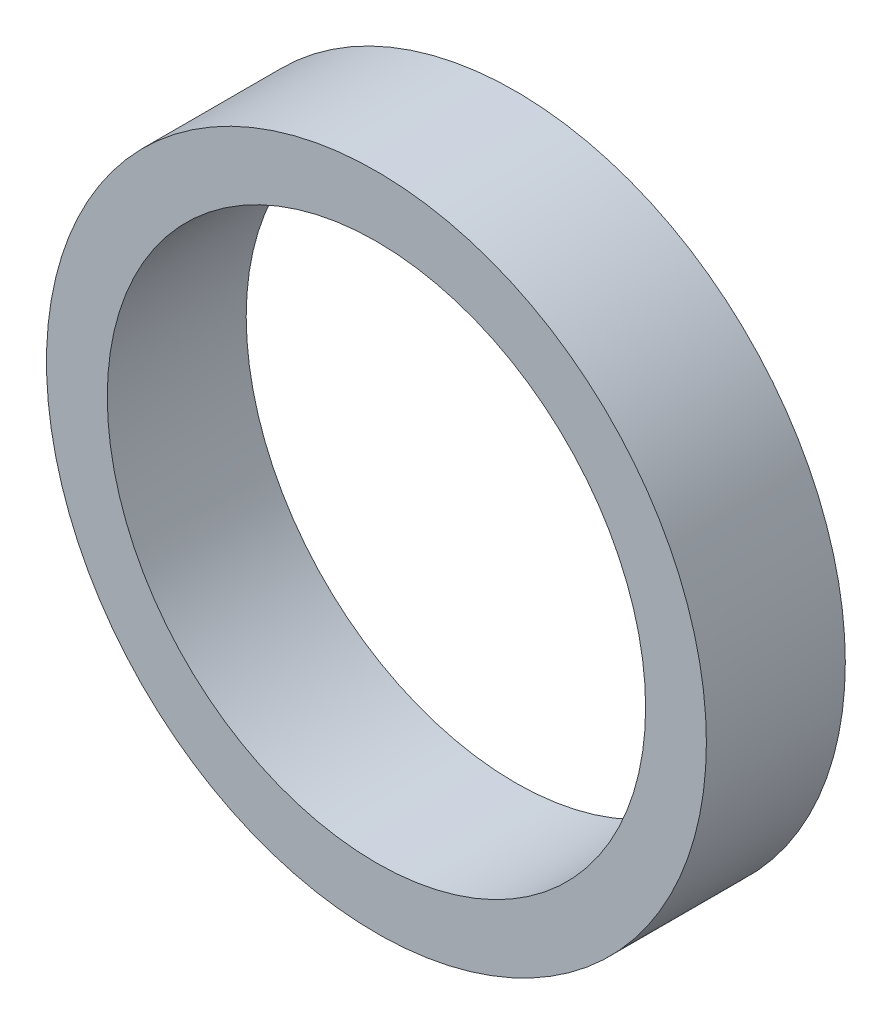
ISO-10303-21;
HEADER;
FILE_DESCRIPTION(('STEP AP214'),'2;1');
FILE_NAME('part.step','',(''),(''),'','','');
FILE_SCHEMA(('AUTOMOTIVE_DESIGN { 1 0 10303 214 1 1 1 1 }'));
ENDSEC;
DATA;
#1=APPLICATION_CONTEXT('core data for automotive mechanical design processes');
#2=APPLICATION_PROTOCOL_DEFINITION('international standard','automotive_design',2000,#1);
#3=PRODUCT_CONTEXT('',#1,'mechanical');
#4=PRODUCT('Part','Part','',(#3));
#5=PRODUCT_RELATED_PRODUCT_CATEGORY('part','',(#4));
#6=PRODUCT_DEFINITION_FORMATION('','',#4);
#7=PRODUCT_DEFINITION_CONTEXT('part definition',#1,'design');
#8=PRODUCT_DEFINITION('design','',#6,#7);
#9=PRODUCT_DEFINITION_SHAPE('','',#8);
#10=(LENGTH_UNIT() NAMED_UNIT(*) SI_UNIT(.MILLI.,.METRE.));
#11=(NAMED_UNIT(*) PLANE_ANGLE_UNIT() SI_UNIT($,.RADIAN.));
#12=(NAMED_UNIT(*) SI_UNIT($,.STERADIAN.) SOLID_ANGLE_UNIT());
#13=UNCERTAINTY_MEASURE_WITH_UNIT(LENGTH_MEASURE(1.E-05),#10,'distance_accuracy_value','');
#14=(GEOMETRIC_REPRESENTATION_CONTEXT(3) GLOBAL_UNCERTAINTY_ASSIGNED_CONTEXT((#13)) GLOBAL_UNIT_ASSIGNED_CONTEXT((#10,
#11,#12)) REPRESENTATION_CONTEXT('',''));
#15=CARTESIAN_POINT('',(0.,0.,0.));
#16=DIRECTION('',(0.,0.,1.));
#17=DIRECTION('',(1.,0.,0.));
#18=AXIS2_PLACEMENT_3D('',#15,#16,#17);
#19=CARTESIAN_POINT('',(0.,0.,8.));
#20=DIRECTION('',(0.,0.,1.));
#21=DIRECTION('',(1.,0.,0.));
#22=AXIS2_PLACEMENT_3D('',#19,#20,#21);
#23=PLANE('',#22);
#24=CARTESIAN_POINT('',(0.,0.,8.));
#25=DIRECTION('',(0.,0.,1.));
#26=DIRECTION('',(1.,0.,0.));
#27=AXIS2_PLACEMENT_3D('',#24,#25,#26);
#28=CIRCLE('',#27,19.);
#29=CARTESIAN_POINT('',(19.,0.,8.));
#30=VERTEX_POINT('',#29);
#31=EDGE_CURVE('E10',#30,#30,#28,.T.);
#32=ORIENTED_EDGE('',*,*,#31,.T.);
#33=EDGE_LOOP('',(#32));
#34=FACE_BOUND('',#33,.T.);
#35=CARTESIAN_POINT('',(0.,0.,8.));
#36=DIRECTION('',(0.,0.,1.));
#37=DIRECTION('',(1.,0.,0.));
#38=AXIS2_PLACEMENT_3D('',#35,#36,#37);
#39=CIRCLE('',#38,15.5);
#40=CARTESIAN_POINT('',(15.5,0.,8.));
#41=VERTEX_POINT('',#40);
#42=EDGE_CURVE('E42',#41,#41,#39,.T.);
#43=ORIENTED_EDGE('',*,*,#42,.F.);
#44=EDGE_LOOP('',(#43));
#45=FACE_BOUND('',#44,.T.);
#46=ADVANCED_FACE('F31',(#34,#45),#23,.T.);
#47=CARTESIAN_POINT('',(0.,0.,0.));
#48=DIRECTION('',(0.,0.,1.));
#49=DIRECTION('',(1.,0.,0.));
#50=AXIS2_PLACEMENT_3D('',#47,#48,#49);
#51=PLANE('',#50);
#52=CARTESIAN_POINT('',(0.,0.,0.));
#53=DIRECTION('',(0.,0.,1.));
#54=DIRECTION('',(1.,0.,0.));
#55=AXIS2_PLACEMENT_3D('',#52,#53,#54);
#56=CIRCLE('',#55,19.);
#57=CARTESIAN_POINT('',(19.,0.,0.));
#58=VERTEX_POINT('',#57);
#59=EDGE_CURVE('E35',#58,#58,#56,.T.);
#60=ORIENTED_EDGE('',*,*,#59,.F.);
#61=EDGE_LOOP('',(#60));
#62=FACE_BOUND('',#61,.T.);
#63=CARTESIAN_POINT('',(0.,0.,0.));
#64=DIRECTION('',(0.,0.,1.));
#65=DIRECTION('',(1.,0.,0.));
#66=AXIS2_PLACEMENT_3D('',#63,#64,#65);
#67=CIRCLE('',#66,15.5);
#68=CARTESIAN_POINT('',(15.5,0.,0.));
#69=VERTEX_POINT('',#68);
#70=EDGE_CURVE('E44',#69,#69,#67,.T.);
#71=ORIENTED_EDGE('',*,*,#70,.T.);
#72=EDGE_LOOP('',(#71));
#73=FACE_BOUND('',#72,.T.);
#74=ADVANCED_FACE('F54',(#62,#73),#51,.F.);
#75=CARTESIAN_POINT('',(0.,0.,8.));
#76=DIRECTION('',(0.,0.,-1.));
#77=DIRECTION('',(-1.,0.,0.));
#78=AXIS2_PLACEMENT_3D('',#75,#76,#77);
#79=CYLINDRICAL_SURFACE('',#78,19.);
#80=ORIENTED_EDGE('',*,*,#31,.F.);
#81=EDGE_LOOP('',(#80));
#82=FACE_BOUND('',#81,.T.);
#83=ORIENTED_EDGE('',*,*,#59,.T.);
#84=EDGE_LOOP('',(#83));
#85=FACE_BOUND('',#84,.T.);
#86=ADVANCED_FACE('F33',(#82,#85),#79,.T.);
#87=CARTESIAN_POINT('',(0.,0.,8.));
#88=DIRECTION('',(0.,0.,-1.));
#89=DIRECTION('',(-1.,0.,0.));
#90=AXIS2_PLACEMENT_3D('',#87,#88,#89);
#91=CYLINDRICAL_SURFACE('',#90,15.5);
#92=ORIENTED_EDGE('',*,*,#42,.T.);
#93=EDGE_LOOP('',(#92));
#94=FACE_BOUND('',#93,.T.);
#95=ORIENTED_EDGE('',*,*,#70,.F.);
#96=EDGE_LOOP('',(#95));
#97=FACE_BOUND('',#96,.T.);
#98=ADVANCED_FACE('F50',(#94,#97),#91,.F.);
#99=CLOSED_SHELL('',(#46,#74,#86,#98));
#100=MANIFOLD_SOLID_BREP('B2',#99);
#101=ADVANCED_BREP_SHAPE_REPRESENTATION('',(#18,#100),#14);
#102=SHAPE_DEFINITION_REPRESENTATION(#9,#101);
ENDSEC;
END-ISO-10303-21;
